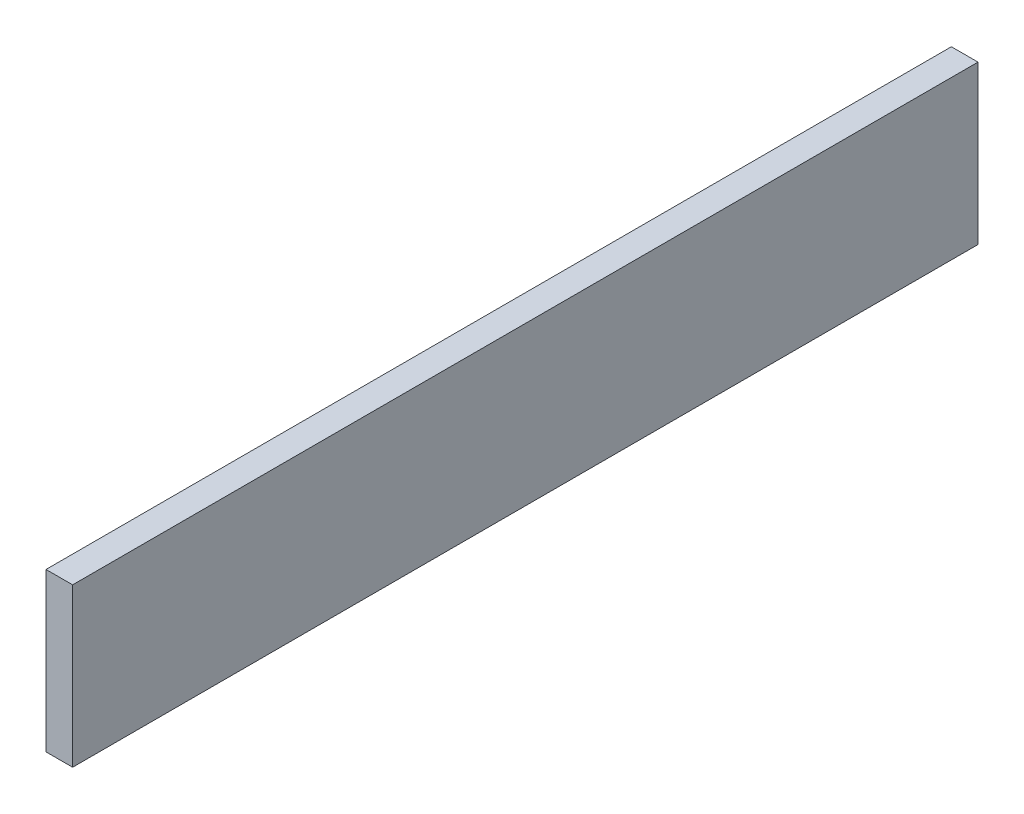
ISO-10303-21;
HEADER;
FILE_DESCRIPTION(('STEP AP214'),'2;1');
FILE_NAME('part.step','',(''),(''),'','','');
FILE_SCHEMA(('AUTOMOTIVE_DESIGN { 1 0 10303 214 1 1 1 1 }'));
ENDSEC;
DATA;
#1=APPLICATION_CONTEXT('core data for automotive mechanical design processes');
#2=APPLICATION_PROTOCOL_DEFINITION('international standard','automotive_design',2000,#1);
#3=PRODUCT_CONTEXT('',#1,'mechanical');
#4=PRODUCT('Part','Part','',(#3));
#5=PRODUCT_RELATED_PRODUCT_CATEGORY('part','',(#4));
#6=PRODUCT_DEFINITION_FORMATION('','',#4);
#7=PRODUCT_DEFINITION_CONTEXT('part definition',#1,'design');
#8=PRODUCT_DEFINITION('design','',#6,#7);
#9=PRODUCT_DEFINITION_SHAPE('','',#8);
#10=(LENGTH_UNIT() NAMED_UNIT(*) SI_UNIT(.MILLI.,.METRE.));
#11=(NAMED_UNIT(*) PLANE_ANGLE_UNIT() SI_UNIT($,.RADIAN.));
#12=(NAMED_UNIT(*) SI_UNIT($,.STERADIAN.) SOLID_ANGLE_UNIT());
#13=UNCERTAINTY_MEASURE_WITH_UNIT(LENGTH_MEASURE(1.E-05),#10,'distance_accuracy_value','');
#14=(GEOMETRIC_REPRESENTATION_CONTEXT(3) GLOBAL_UNCERTAINTY_ASSIGNED_CONTEXT((#13)) GLOBAL_UNIT_ASSIGNED_CONTEXT((#10,
#11,#12)) REPRESENTATION_CONTEXT('',''));
#15=CARTESIAN_POINT('',(0.,0.,0.));
#16=DIRECTION('',(0.,0.,1.));
#17=DIRECTION('',(1.,0.,0.));
#18=AXIS2_PLACEMENT_3D('',#15,#16,#17);
#19=CARTESIAN_POINT('',(15.,0.,0.));
#20=DIRECTION('',(0.,0.,-1.));
#21=DIRECTION('',(-1.,0.,0.));
#22=AXIS2_PLACEMENT_3D('',#19,#20,#21);
#23=PLANE('',#22);
#24=DIRECTION('',(0.,-1.,0.));
#25=VECTOR('',#24,1.);
#26=CARTESIAN_POINT('',(0.,0.,0.));
#27=LINE('',#26,#25);
#28=CARTESIAN_POINT('',(0.,89.,0.));
#29=VERTEX_POINT('',#28);
#30=CARTESIAN_POINT('',(0.,0.,0.));
#31=VERTEX_POINT('',#30);
#32=EDGE_CURVE('E96',#29,#31,#27,.T.);
#33=ORIENTED_EDGE('',*,*,#32,.T.);
#34=DIRECTION('',(-1.,0.,0.));
#35=VECTOR('',#34,1.);
#36=CARTESIAN_POINT('',(15.,0.,0.));
#37=LINE('',#36,#35);
#38=CARTESIAN_POINT('',(15.,0.,0.));
#39=VERTEX_POINT('',#38);
#40=EDGE_CURVE('E11',#39,#31,#37,.T.);
#41=ORIENTED_EDGE('',*,*,#40,.F.);
#42=DIRECTION('',(0.,-1.,0.));
#43=VECTOR('',#42,1.);
#44=CARTESIAN_POINT('',(15.,0.,0.));
#45=LINE('',#44,#43);
#46=CARTESIAN_POINT('',(15.,89.,0.));
#47=VERTEX_POINT('',#46);
#48=EDGE_CURVE('E84',#47,#39,#45,.T.);
#49=ORIENTED_EDGE('',*,*,#48,.F.);
#50=DIRECTION('',(-1.,0.,0.));
#51=VECTOR('',#50,1.);
#52=CARTESIAN_POINT('',(15.,89.,0.));
#53=LINE('',#52,#51);
#54=EDGE_CURVE('E92',#47,#29,#53,.T.);
#55=ORIENTED_EDGE('',*,*,#54,.T.);
#56=EDGE_LOOP('',(#33,#41,#49,#55));
#57=FACE_BOUND('',#56,.T.);
#58=ADVANCED_FACE('F33',(#57),#23,.F.);
#59=CARTESIAN_POINT('',(15.,0.,0.));
#60=DIRECTION('',(0.,1.,0.));
#61=DIRECTION('',(0.,0.,1.));
#62=AXIS2_PLACEMENT_3D('',#59,#60,#61);
#63=PLANE('',#62);
#64=DIRECTION('',(0.,0.,-1.));
#65=VECTOR('',#64,1.);
#66=CARTESIAN_POINT('',(0.,0.,0.));
#67=LINE('',#66,#65);
#68=CARTESIAN_POINT('',(0.,0.,-510.));
#69=VERTEX_POINT('',#68);
#70=EDGE_CURVE('E88',#31,#69,#67,.T.);
#71=ORIENTED_EDGE('',*,*,#70,.T.);
#72=DIRECTION('',(-1.,0.,0.));
#73=VECTOR('',#72,1.);
#74=CARTESIAN_POINT('',(15.,0.,-510.));
#75=LINE('',#74,#73);
#76=CARTESIAN_POINT('',(15.,0.,-510.));
#77=VERTEX_POINT('',#76);
#78=EDGE_CURVE('E41',#77,#69,#75,.T.);
#79=ORIENTED_EDGE('',*,*,#78,.F.);
#80=DIRECTION('',(0.,0.,-1.));
#81=VECTOR('',#80,1.);
#82=CARTESIAN_POINT('',(15.,0.,0.));
#83=LINE('',#82,#81);
#84=EDGE_CURVE('E79',#39,#77,#83,.T.);
#85=ORIENTED_EDGE('',*,*,#84,.F.);
#86=ORIENTED_EDGE('',*,*,#40,.T.);
#87=EDGE_LOOP('',(#71,#79,#85,#86));
#88=FACE_BOUND('',#87,.T.);
#89=ADVANCED_FACE('F87',(#88),#63,.F.);
#90=CARTESIAN_POINT('',(15.,0.,-510.));
#91=DIRECTION('',(0.,0.,1.));
#92=DIRECTION('',(1.,0.,0.));
#93=AXIS2_PLACEMENT_3D('',#90,#91,#92);
#94=PLANE('',#93);
#95=DIRECTION('',(0.,1.,0.));
#96=VECTOR('',#95,1.);
#97=CARTESIAN_POINT('',(0.,0.,-510.));
#98=LINE('',#97,#96);
#99=CARTESIAN_POINT('',(0.,89.,-510.));
#100=VERTEX_POINT('',#99);
#101=EDGE_CURVE('E66',#69,#100,#98,.T.);
#102=ORIENTED_EDGE('',*,*,#101,.T.);
#103=DIRECTION('',(-1.,0.,0.));
#104=VECTOR('',#103,1.);
#105=CARTESIAN_POINT('',(15.,89.,-510.));
#106=LINE('',#105,#104);
#107=CARTESIAN_POINT('',(15.,89.,-510.));
#108=VERTEX_POINT('',#107);
#109=EDGE_CURVE('E89',#108,#100,#106,.T.);
#110=ORIENTED_EDGE('',*,*,#109,.F.);
#111=DIRECTION('',(0.,1.,0.));
#112=VECTOR('',#111,1.);
#113=CARTESIAN_POINT('',(15.,0.,-510.));
#114=LINE('',#113,#112);
#115=EDGE_CURVE('E82',#77,#108,#114,.T.);
#116=ORIENTED_EDGE('',*,*,#115,.F.);
#117=ORIENTED_EDGE('',*,*,#78,.T.);
#118=EDGE_LOOP('',(#102,#110,#116,#117));
#119=FACE_BOUND('',#118,.T.);
#120=ADVANCED_FACE('F90',(#119),#94,.F.);
#121=CARTESIAN_POINT('',(15.,89.,0.));
#122=DIRECTION('',(0.,-1.,0.));
#123=DIRECTION('',(0.,0.,-1.));
#124=AXIS2_PLACEMENT_3D('',#121,#122,#123);
#125=PLANE('',#124);
#126=DIRECTION('',(0.,0.,1.));
#127=VECTOR('',#126,1.);
#128=CARTESIAN_POINT('',(0.,89.,0.));
#129=LINE('',#128,#127);
#130=EDGE_CURVE('E72',#100,#29,#129,.T.);
#131=ORIENTED_EDGE('',*,*,#130,.T.);
#132=ORIENTED_EDGE('',*,*,#54,.F.);
#133=DIRECTION('',(0.,0.,1.));
#134=VECTOR('',#133,1.);
#135=CARTESIAN_POINT('',(15.,89.,0.));
#136=LINE('',#135,#134);
#137=EDGE_CURVE('E49',#108,#47,#136,.T.);
#138=ORIENTED_EDGE('',*,*,#137,.F.);
#139=ORIENTED_EDGE('',*,*,#109,.T.);
#140=EDGE_LOOP('',(#131,#132,#138,#139));
#141=FACE_BOUND('',#140,.T.);
#142=ADVANCED_FACE('F103',(#141),#125,.F.);
#143=CARTESIAN_POINT('',(15.,0.,0.));
#144=DIRECTION('',(-1.,0.,0.));
#145=DIRECTION('',(0.,0.,1.));
#146=AXIS2_PLACEMENT_3D('',#143,#144,#145);
#147=PLANE('',#146);
#148=ORIENTED_EDGE('',*,*,#48,.T.);
#149=ORIENTED_EDGE('',*,*,#84,.T.);
#150=ORIENTED_EDGE('',*,*,#115,.T.);
#151=ORIENTED_EDGE('',*,*,#137,.T.);
#152=EDGE_LOOP('',(#148,#149,#150,#151));
#153=FACE_BOUND('',#152,.T.);
#154=ADVANCED_FACE('F80',(#153),#147,.F.);
#155=CARTESIAN_POINT('',(0.,0.,0.));
#156=DIRECTION('',(-1.,0.,0.));
#157=DIRECTION('',(0.,0.,1.));
#158=AXIS2_PLACEMENT_3D('',#155,#156,#157);
#159=PLANE('',#158);
#160=ORIENTED_EDGE('',*,*,#32,.F.);
#161=ORIENTED_EDGE('',*,*,#130,.F.);
#162=ORIENTED_EDGE('',*,*,#101,.F.);
#163=ORIENTED_EDGE('',*,*,#70,.F.);
#164=EDGE_LOOP('',(#160,#161,#162,#163));
#165=FACE_BOUND('',#164,.T.);
#166=ADVANCED_FACE('F106',(#165),#159,.T.);
#167=CLOSED_SHELL('',(#58,#89,#120,#142,#154,#166));
#168=MANIFOLD_SOLID_BREP('B2',#167);
#169=ADVANCED_BREP_SHAPE_REPRESENTATION('',(#18,#168),#14);
#170=SHAPE_DEFINITION_REPRESENTATION(#9,#169);
ENDSEC;
END-ISO-10303-21;
